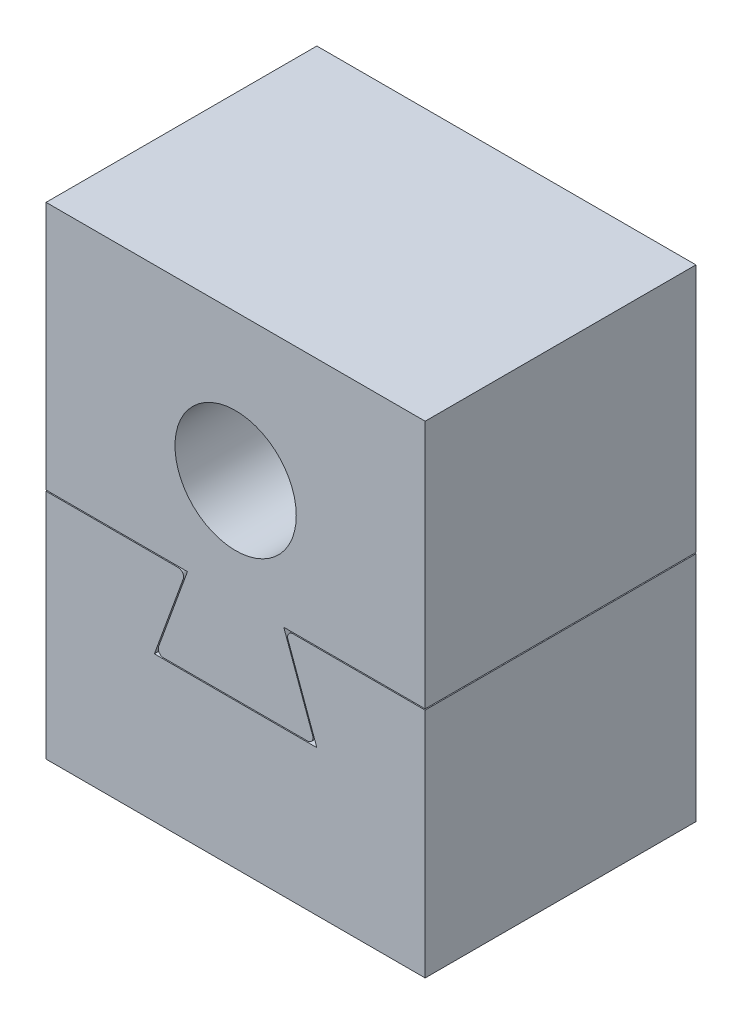
ISO-10303-21;
HEADER;
FILE_DESCRIPTION(('STEP AP214'),'2;1');
FILE_NAME('part.step','',(''),(''),'','','');
FILE_SCHEMA(('AUTOMOTIVE_DESIGN { 1 0 10303 214 1 1 1 1 }'));
ENDSEC;
DATA;
#1=APPLICATION_CONTEXT('core data for automotive mechanical design processes');
#2=APPLICATION_PROTOCOL_DEFINITION('international standard','automotive_design',2000,#1);
#3=PRODUCT_CONTEXT('',#1,'mechanical');
#4=PRODUCT('Part','Part','',(#3));
#5=PRODUCT_RELATED_PRODUCT_CATEGORY('part','',(#4));
#6=PRODUCT_DEFINITION_FORMATION('','',#4);
#7=PRODUCT_DEFINITION_CONTEXT('part definition',#1,'design');
#8=PRODUCT_DEFINITION('design','',#6,#7);
#9=PRODUCT_DEFINITION_SHAPE('','',#8);
#10=(LENGTH_UNIT() NAMED_UNIT(*) SI_UNIT(.MILLI.,.METRE.));
#11=(NAMED_UNIT(*) PLANE_ANGLE_UNIT() SI_UNIT($,.RADIAN.));
#12=(NAMED_UNIT(*) SI_UNIT($,.STERADIAN.) SOLID_ANGLE_UNIT());
#13=UNCERTAINTY_MEASURE_WITH_UNIT(LENGTH_MEASURE(1.E-05),#10,'distance_accuracy_value','');
#14=(GEOMETRIC_REPRESENTATION_CONTEXT(3) GLOBAL_UNCERTAINTY_ASSIGNED_CONTEXT((#13)) GLOBAL_UNIT_ASSIGNED_CONTEXT((#10,
#11,#12)) REPRESENTATION_CONTEXT('',''));
#15=CARTESIAN_POINT('',(0.,0.,0.));
#16=DIRECTION('',(0.,0.,1.));
#17=DIRECTION('',(1.,0.,0.));
#18=AXIS2_PLACEMENT_3D('',#15,#16,#17);
#19=CARTESIAN_POINT('',(0.,0.,25.));
#20=DIRECTION('',(0.,0.,1.));
#21=DIRECTION('',(1.,0.,0.));
#22=AXIS2_PLACEMENT_3D('',#19,#20,#21);
#23=PLANE('',#22);
#24=DIRECTION('',(-1.,0.,0.));
#25=VECTOR('',#24,1.);
#26=CARTESIAN_POINT('',(-7.5,-17.5,25.));
#27=LINE('',#26,#25);
#28=CARTESIAN_POINT('',(6.64311119595473,-17.5,25.));
#29=VERTEX_POINT('',#28);
#30=CARTESIAN_POINT('',(-6.64311119595473,-17.5,25.));
#31=VERTEX_POINT('',#30);
#32=EDGE_CURVE('E214',#29,#31,#27,.T.);
#33=ORIENTED_EDGE('',*,*,#32,.F.);
#34=CARTESIAN_POINT('',(6.64311119595473,-17.,25.));
#35=DIRECTION('',(0.,0.,1.));
#36=DIRECTION('',(1.,0.,0.));
#37=AXIS2_PLACEMENT_3D('',#34,#35,#36);
#38=CIRCLE('',#37,0.5);
#39=CARTESIAN_POINT('',(7.11295750634769,-16.8289899283372,25.));
#40=VERTEX_POINT('',#39);
#41=EDGE_CURVE('E71',#29,#40,#38,.T.);
#42=ORIENTED_EDGE('',*,*,#41,.T.);
#43=DIRECTION('',(0.342020143325667,-0.939692620785909,0.));
#44=VECTOR('',#43,1.);
#45=CARTESIAN_POINT('',(4.49426886379181,-9.63420201433257,25.));
#46=LINE('',#45,#44);
#47=CARTESIAN_POINT('',(4.4454233251962,-9.5,25.));
#48=VERTEX_POINT('',#47);
#49=EDGE_CURVE('E213',#48,#40,#46,.T.);
#50=ORIENTED_EDGE('',*,*,#49,.F.);
#51=DIRECTION('',(-1.,0.,0.));
#52=VECTOR('',#51,1.);
#53=CARTESIAN_POINT('',(17.5,-9.5,25.));
#54=LINE('',#53,#52);
#55=CARTESIAN_POINT('',(17.5,-9.5,25.));
#56=VERTEX_POINT('',#55);
#57=EDGE_CURVE('E167',#56,#48,#54,.T.);
#58=ORIENTED_EDGE('',*,*,#57,.F.);
#59=DIRECTION('',(0.,1.,0.));
#60=VECTOR('',#59,1.);
#61=CARTESIAN_POINT('',(17.5,13.5,25.));
#62=LINE('',#61,#60);
#63=CARTESIAN_POINT('',(17.5,13.5,25.));
#64=VERTEX_POINT('',#63);
#65=EDGE_CURVE('E143',#56,#64,#62,.T.);
#66=ORIENTED_EDGE('',*,*,#65,.T.);
#67=DIRECTION('',(-1.,0.,0.));
#68=VECTOR('',#67,1.);
#69=CARTESIAN_POINT('',(-17.5,13.5,25.));
#70=LINE('',#69,#68);
#71=CARTESIAN_POINT('',(-17.5,13.5,25.));
#72=VERTEX_POINT('',#71);
#73=EDGE_CURVE('E184',#64,#72,#70,.T.);
#74=ORIENTED_EDGE('',*,*,#73,.T.);
#75=DIRECTION('',(0.,-1.,0.));
#76=VECTOR('',#75,1.);
#77=CARTESIAN_POINT('',(-17.5,13.5,25.));
#78=LINE('',#77,#76);
#79=CARTESIAN_POINT('',(-17.5,-9.5,25.));
#80=VERTEX_POINT('',#79);
#81=EDGE_CURVE('E156',#72,#80,#78,.T.);
#82=ORIENTED_EDGE('',*,*,#81,.T.);
#83=DIRECTION('',(1.,0.,0.));
#84=VECTOR('',#83,1.);
#85=CARTESIAN_POINT('',(-17.5,-9.5,25.));
#86=LINE('',#85,#84);
#87=CARTESIAN_POINT('',(-4.44542332519619,-9.5,25.));
#88=VERTEX_POINT('',#87);
#89=EDGE_CURVE('E218',#88,#80,#86,.F.);
#90=ORIENTED_EDGE('',*,*,#89,.F.);
#91=DIRECTION('',(0.342020143325666,0.939692620785909,0.));
#92=VECTOR('',#91,1.);
#93=CARTESIAN_POINT('',(-4.49426886379181,-9.63420201433257,25.));
#94=LINE('',#93,#92);
#95=CARTESIAN_POINT('',(-7.11295750634768,-16.8289899283372,25.));
#96=VERTEX_POINT('',#95);
#97=EDGE_CURVE('E209',#96,#88,#94,.T.);
#98=ORIENTED_EDGE('',*,*,#97,.F.);
#99=CARTESIAN_POINT('',(-6.64311119595473,-17.,25.));
#100=DIRECTION('',(0.,0.,1.));
#101=DIRECTION('',(1.,0.,0.));
#102=AXIS2_PLACEMENT_3D('',#99,#100,#101);
#103=CIRCLE('',#102,0.5);
#104=EDGE_CURVE('E166',#96,#31,#103,.T.);
#105=ORIENTED_EDGE('',*,*,#104,.T.);
#106=EDGE_LOOP('',(#33,#42,#50,#58,#66,#74,#82,#90,#98,#105));
#107=FACE_BOUND('',#106,.T.);
#108=CARTESIAN_POINT('',(0.,0.,25.));
#109=DIRECTION('',(0.,0.,1.));
#110=DIRECTION('',(1.,0.,0.));
#111=AXIS2_PLACEMENT_3D('',#108,#109,#110);
#112=CIRCLE('',#111,5.6);
#113=CARTESIAN_POINT('',(5.6,0.,25.));
#114=VERTEX_POINT('',#113);
#115=EDGE_CURVE('E201',#114,#114,#112,.T.);
#116=ORIENTED_EDGE('',*,*,#115,.F.);
#117=EDGE_LOOP('',(#116));
#118=FACE_BOUND('',#117,.T.);
#119=ADVANCED_FACE('F47',(#107,#118),#23,.T.);
#120=CARTESIAN_POINT('',(0.,0.,0.));
#121=DIRECTION('',(0.,0.,1.));
#122=DIRECTION('',(1.,0.,0.));
#123=AXIS2_PLACEMENT_3D('',#120,#121,#122);
#124=PLANE('',#123);
#125=DIRECTION('',(0.342020143325667,-0.939692620785909,0.));
#126=VECTOR('',#125,1.);
#127=CARTESIAN_POINT('',(0.872166434376077,0.317442621438977,0.));
#128=LINE('',#127,#126);
#129=CARTESIAN_POINT('',(4.4454233251962,-9.5,0.));
#130=VERTEX_POINT('',#129);
#131=CARTESIAN_POINT('',(7.11295750634769,-16.8289899283372,0.));
#132=VERTEX_POINT('',#131);
#133=EDGE_CURVE('E134',#130,#132,#128,.T.);
#134=ORIENTED_EDGE('',*,*,#133,.T.);
#135=CARTESIAN_POINT('',(6.64311119595473,-17.,0.));
#136=DIRECTION('',(0.,0.,1.));
#137=DIRECTION('',(1.,0.,0.));
#138=AXIS2_PLACEMENT_3D('',#135,#136,#137);
#139=CIRCLE('',#138,0.5);
#140=CARTESIAN_POINT('',(6.64311119595473,-17.5,0.));
#141=VERTEX_POINT('',#140);
#142=EDGE_CURVE('E12',#132,#141,#139,.F.);
#143=ORIENTED_EDGE('',*,*,#142,.T.);
#144=DIRECTION('',(-1.,0.,0.));
#145=VECTOR('',#144,1.);
#146=CARTESIAN_POINT('',(0.,-17.5,0.));
#147=LINE('',#146,#145);
#148=CARTESIAN_POINT('',(-6.64311119595473,-17.5,0.));
#149=VERTEX_POINT('',#148);
#150=EDGE_CURVE('E195',#141,#149,#147,.T.);
#151=ORIENTED_EDGE('',*,*,#150,.T.);
#152=CARTESIAN_POINT('',(-6.64311119595473,-17.,0.));
#153=DIRECTION('',(0.,0.,1.));
#154=DIRECTION('',(1.,0.,0.));
#155=AXIS2_PLACEMENT_3D('',#152,#153,#154);
#156=CIRCLE('',#155,0.5);
#157=CARTESIAN_POINT('',(-7.11295750634768,-16.8289899283372,0.));
#158=VERTEX_POINT('',#157);
#159=EDGE_CURVE('E173',#149,#158,#156,.F.);
#160=ORIENTED_EDGE('',*,*,#159,.T.);
#161=DIRECTION('',(0.342020143325666,0.939692620785909,0.));
#162=VECTOR('',#161,1.);
#163=CARTESIAN_POINT('',(-0.872166434376076,0.317442621438976,0.));
#164=LINE('',#163,#162);
#165=CARTESIAN_POINT('',(-4.44542332519619,-9.5,0.));
#166=VERTEX_POINT('',#165);
#167=EDGE_CURVE('E193',#158,#166,#164,.T.);
#168=ORIENTED_EDGE('',*,*,#167,.T.);
#169=DIRECTION('',(-1.,0.,0.));
#170=VECTOR('',#169,1.);
#171=CARTESIAN_POINT('',(0.,-9.5,0.));
#172=LINE('',#171,#170);
#173=CARTESIAN_POINT('',(-17.5,-9.5,0.));
#174=VERTEX_POINT('',#173);
#175=EDGE_CURVE('E135',#166,#174,#172,.T.);
#176=ORIENTED_EDGE('',*,*,#175,.T.);
#177=DIRECTION('',(0.,-1.,0.));
#178=VECTOR('',#177,1.);
#179=CARTESIAN_POINT('',(-17.5,13.5,0.));
#180=LINE('',#179,#178);
#181=CARTESIAN_POINT('',(-17.5,13.5,0.));
#182=VERTEX_POINT('',#181);
#183=EDGE_CURVE('E158',#182,#174,#180,.T.);
#184=ORIENTED_EDGE('',*,*,#183,.F.);
#185=DIRECTION('',(-1.,0.,0.));
#186=VECTOR('',#185,1.);
#187=CARTESIAN_POINT('',(-17.5,13.5,0.));
#188=LINE('',#187,#186);
#189=CARTESIAN_POINT('',(17.5,13.5,0.));
#190=VERTEX_POINT('',#189);
#191=EDGE_CURVE('E150',#190,#182,#188,.T.);
#192=ORIENTED_EDGE('',*,*,#191,.F.);
#193=DIRECTION('',(0.,1.,0.));
#194=VECTOR('',#193,1.);
#195=CARTESIAN_POINT('',(17.5,13.5,0.));
#196=LINE('',#195,#194);
#197=CARTESIAN_POINT('',(17.5,-9.49999999999999,0.));
#198=VERTEX_POINT('',#197);
#199=EDGE_CURVE('E141',#198,#190,#196,.T.);
#200=ORIENTED_EDGE('',*,*,#199,.F.);
#201=DIRECTION('',(-1.,0.,0.));
#202=VECTOR('',#201,1.);
#203=CARTESIAN_POINT('',(0.,-9.5,0.));
#204=LINE('',#203,#202);
#205=EDGE_CURVE('E125',#198,#130,#204,.T.);
#206=ORIENTED_EDGE('',*,*,#205,.T.);
#207=EDGE_LOOP('',(#134,#143,#151,#160,#168,#176,#184,#192,#200,#206));
#208=FACE_BOUND('',#207,.T.);
#209=CARTESIAN_POINT('',(0.,0.,0.));
#210=DIRECTION('',(0.,0.,1.));
#211=DIRECTION('',(1.,0.,0.));
#212=AXIS2_PLACEMENT_3D('',#209,#210,#211);
#213=CIRCLE('',#212,5.6);
#214=CARTESIAN_POINT('',(5.6,0.,0.));
#215=VERTEX_POINT('',#214);
#216=EDGE_CURVE('E162',#215,#215,#213,.T.);
#217=ORIENTED_EDGE('',*,*,#216,.T.);
#218=EDGE_LOOP('',(#217));
#219=FACE_BOUND('',#218,.T.);
#220=ADVANCED_FACE('F147',(#208,#219),#124,.F.);
#221=CARTESIAN_POINT('',(-17.5,13.5,25.));
#222=DIRECTION('',(1.,0.,0.));
#223=DIRECTION('',(0.,1.,0.));
#224=AXIS2_PLACEMENT_3D('',#221,#222,#223);
#225=PLANE('',#224);
#226=ORIENTED_EDGE('',*,*,#183,.T.);
#227=DIRECTION('',(0.,0.,1.));
#228=VECTOR('',#227,1.);
#229=CARTESIAN_POINT('',(-17.5,-9.5,25.));
#230=LINE('',#229,#228);
#231=EDGE_CURVE('E161',#174,#80,#230,.T.);
#232=ORIENTED_EDGE('',*,*,#231,.T.);
#233=ORIENTED_EDGE('',*,*,#81,.F.);
#234=DIRECTION('',(0.,0.,-1.));
#235=VECTOR('',#234,1.);
#236=CARTESIAN_POINT('',(-17.5,13.5,25.));
#237=LINE('',#236,#235);
#238=EDGE_CURVE('E144',#72,#182,#237,.T.);
#239=ORIENTED_EDGE('',*,*,#238,.T.);
#240=EDGE_LOOP('',(#226,#232,#233,#239));
#241=FACE_BOUND('',#240,.T.);
#242=ADVANCED_FACE('F232',(#241),#225,.F.);
#243=CARTESIAN_POINT('',(17.5,13.5,25.));
#244=DIRECTION('',(-1.,0.,0.));
#245=DIRECTION('',(0.,-1.,0.));
#246=AXIS2_PLACEMENT_3D('',#243,#244,#245);
#247=PLANE('',#246);
#248=ORIENTED_EDGE('',*,*,#65,.F.);
#249=DIRECTION('',(0.,0.,-1.));
#250=VECTOR('',#249,1.);
#251=CARTESIAN_POINT('',(17.5,-9.5,25.));
#252=LINE('',#251,#250);
#253=EDGE_CURVE('E129',#56,#198,#252,.T.);
#254=ORIENTED_EDGE('',*,*,#253,.T.);
#255=ORIENTED_EDGE('',*,*,#199,.T.);
#256=DIRECTION('',(0.,0.,-1.));
#257=VECTOR('',#256,1.);
#258=CARTESIAN_POINT('',(17.5,13.5,25.));
#259=LINE('',#258,#257);
#260=EDGE_CURVE('E152',#64,#190,#259,.T.);
#261=ORIENTED_EDGE('',*,*,#260,.F.);
#262=EDGE_LOOP('',(#248,#254,#255,#261));
#263=FACE_BOUND('',#262,.T.);
#264=ADVANCED_FACE('F139',(#263),#247,.F.);
#265=CARTESIAN_POINT('',(-17.5,13.5,25.));
#266=DIRECTION('',(0.,-1.,0.));
#267=DIRECTION('',(1.,0.,0.));
#268=AXIS2_PLACEMENT_3D('',#265,#266,#267);
#269=PLANE('',#268);
#270=ORIENTED_EDGE('',*,*,#191,.T.);
#271=ORIENTED_EDGE('',*,*,#238,.F.);
#272=ORIENTED_EDGE('',*,*,#73,.F.);
#273=ORIENTED_EDGE('',*,*,#260,.T.);
#274=EDGE_LOOP('',(#270,#271,#272,#273));
#275=FACE_BOUND('',#274,.T.);
#276=ADVANCED_FACE('F237',(#275),#269,.F.);
#277=CARTESIAN_POINT('',(0.,0.,25.));
#278=DIRECTION('',(0.,0.,-1.));
#279=DIRECTION('',(-1.,0.,0.));
#280=AXIS2_PLACEMENT_3D('',#277,#278,#279);
#281=CYLINDRICAL_SURFACE('',#280,5.6);
#282=ORIENTED_EDGE('',*,*,#115,.T.);
#283=EDGE_LOOP('',(#282));
#284=FACE_BOUND('',#283,.T.);
#285=ORIENTED_EDGE('',*,*,#216,.F.);
#286=EDGE_LOOP('',(#285));
#287=FACE_BOUND('',#286,.T.);
#288=ADVANCED_FACE('F278',(#284,#287),#281,.F.);
#289=CARTESIAN_POINT('',(-4.49426886379181,-9.63420201433257,-5.1));
#290=DIRECTION('',(0.939692620785909,-0.342020143325666,0.));
#291=DIRECTION('',(0.342020143325666,0.939692620785909,0.));
#292=AXIS2_PLACEMENT_3D('',#289,#290,#291);
#293=PLANE('',#292);
#294=CARTESIAN_POINT('',(-5.93770128568761,-13.6,19.));
#295=DIRECTION('',(0.939692620785909,-0.342020143325666,0.));
#296=DIRECTION('',(-0.342020143325666,-0.939692620785909,0.));
#297=AXIS2_PLACEMENT_3D('',#294,#295,#296);
#298=ELLIPSE('',#297,2.2347733221994,2.09999999999999);
#299=CARTESIAN_POINT('',(-6.70203877764662,-15.7,19.));
#300=VERTEX_POINT('',#299);
#301=EDGE_CURVE('E51',#300,#300,#298,.T.);
#302=ORIENTED_EDGE('',*,*,#301,.T.);
#303=EDGE_LOOP('',(#302));
#304=FACE_BOUND('',#303,.T.);
#305=CARTESIAN_POINT('',(-5.93770128568761,-13.6,6.));
#306=DIRECTION('',(0.939692620785909,-0.342020143325666,0.));
#307=DIRECTION('',(-0.342020143325666,-0.939692620785909,0.));
#308=AXIS2_PLACEMENT_3D('',#305,#306,#307);
#309=ELLIPSE('',#308,2.2347733221994,2.09999999999999);
#310=CARTESIAN_POINT('',(-6.70203877764662,-15.7,6.));
#311=VERTEX_POINT('',#310);
#312=EDGE_CURVE('E179',#311,#311,#309,.T.);
#313=ORIENTED_EDGE('',*,*,#312,.T.);
#314=EDGE_LOOP('',(#313));
#315=FACE_BOUND('',#314,.T.);
#316=ORIENTED_EDGE('',*,*,#167,.F.);
#317=DIRECTION('',(0.,0.,1.));
#318=VECTOR('',#317,1.);
#319=CARTESIAN_POINT('',(-7.11295750634768,-16.8289899283372,-5.1));
#320=LINE('',#319,#318);
#321=EDGE_CURVE('E163',#158,#96,#320,.T.);
#322=ORIENTED_EDGE('',*,*,#321,.T.);
#323=ORIENTED_EDGE('',*,*,#97,.T.);
#324=DIRECTION('',(0.,0.,1.));
#325=VECTOR('',#324,1.);
#326=CARTESIAN_POINT('',(-4.44542332519619,-9.5,-5.1));
#327=LINE('',#326,#325);
#328=EDGE_CURVE('E215',#166,#88,#327,.T.);
#329=ORIENTED_EDGE('',*,*,#328,.F.);
#330=EDGE_LOOP('',(#316,#322,#323,#329));
#331=FACE_BOUND('',#330,.T.);
#332=ADVANCED_FACE('F240',(#304,#315,#331),#293,.F.);
#333=CARTESIAN_POINT('',(-7.5,-17.5,-5.1));
#334=DIRECTION('',(0.,1.,0.));
#335=DIRECTION('',(-1.,0.,0.));
#336=AXIS2_PLACEMENT_3D('',#333,#334,#335);
#337=PLANE('',#336);
#338=ORIENTED_EDGE('',*,*,#150,.F.);
#339=DIRECTION('',(0.,0.,1.));
#340=VECTOR('',#339,1.);
#341=CARTESIAN_POINT('',(6.64311119595473,-17.5,-5.1));
#342=LINE('',#341,#340);
#343=EDGE_CURVE('E175',#141,#29,#342,.T.);
#344=ORIENTED_EDGE('',*,*,#343,.T.);
#345=ORIENTED_EDGE('',*,*,#32,.T.);
#346=DIRECTION('',(0.,0.,1.));
#347=VECTOR('',#346,1.);
#348=CARTESIAN_POINT('',(-6.64311119595473,-17.5,-5.1));
#349=LINE('',#348,#347);
#350=EDGE_CURVE('E170',#31,#149,#349,.F.);
#351=ORIENTED_EDGE('',*,*,#350,.T.);
#352=EDGE_LOOP('',(#338,#344,#345,#351));
#353=FACE_BOUND('',#352,.T.);
#354=ADVANCED_FACE('F248',(#353),#337,.F.);
#355=CARTESIAN_POINT('',(4.49426886379181,-9.63420201433257,-5.1));
#356=DIRECTION('',(-0.939692620785909,-0.342020143325667,0.));
#357=DIRECTION('',(0.342020143325667,-0.939692620785909,0.));
#358=AXIS2_PLACEMENT_3D('',#355,#356,#357);
#359=PLANE('',#358);
#360=ORIENTED_EDGE('',*,*,#49,.T.);
#361=DIRECTION('',(0.,0.,1.));
#362=VECTOR('',#361,1.);
#363=CARTESIAN_POINT('',(7.11295750634769,-16.8289899283372,-5.1));
#364=LINE('',#363,#362);
#365=EDGE_CURVE('E56',#40,#132,#364,.F.);
#366=ORIENTED_EDGE('',*,*,#365,.T.);
#367=ORIENTED_EDGE('',*,*,#133,.F.);
#368=DIRECTION('',(0.,0.,1.));
#369=VECTOR('',#368,1.);
#370=CARTESIAN_POINT('',(4.4454233251962,-9.5,-5.1));
#371=LINE('',#370,#369);
#372=EDGE_CURVE('E131',#130,#48,#371,.T.);
#373=ORIENTED_EDGE('',*,*,#372,.T.);
#374=EDGE_LOOP('',(#360,#366,#367,#373));
#375=FACE_BOUND('',#374,.T.);
#376=ADVANCED_FACE('F252',(#375),#359,.F.);
#377=CARTESIAN_POINT('',(-17.5,-9.5,-5.1));
#378=DIRECTION('',(0.,1.,0.));
#379=DIRECTION('',(0.,0.,1.));
#380=AXIS2_PLACEMENT_3D('',#377,#378,#379);
#381=PLANE('',#380);
#382=ORIENTED_EDGE('',*,*,#328,.T.);
#383=ORIENTED_EDGE('',*,*,#89,.T.);
#384=ORIENTED_EDGE('',*,*,#231,.F.);
#385=ORIENTED_EDGE('',*,*,#175,.F.);
#386=EDGE_LOOP('',(#382,#383,#384,#385));
#387=FACE_BOUND('',#386,.T.);
#388=ADVANCED_FACE('F225',(#387),#381,.F.);
#389=CARTESIAN_POINT('',(17.5,-9.5,-5.1));
#390=DIRECTION('',(0.,1.,0.));
#391=DIRECTION('',(-1.,0.,0.));
#392=AXIS2_PLACEMENT_3D('',#389,#390,#391);
#393=PLANE('',#392);
#394=ORIENTED_EDGE('',*,*,#253,.F.);
#395=ORIENTED_EDGE('',*,*,#57,.T.);
#396=ORIENTED_EDGE('',*,*,#372,.F.);
#397=ORIENTED_EDGE('',*,*,#205,.F.);
#398=EDGE_LOOP('',(#394,#395,#396,#397));
#399=FACE_BOUND('',#398,.T.);
#400=ADVANCED_FACE('F127',(#399),#393,.F.);
#401=CARTESIAN_POINT('',(-6.64311119595473,-17.,-5.1));
#402=DIRECTION('',(0.,0.,1.));
#403=DIRECTION('',(1.,0.,0.));
#404=AXIS2_PLACEMENT_3D('',#401,#402,#403);
#405=CYLINDRICAL_SURFACE('',#404,0.5);
#406=ORIENTED_EDGE('',*,*,#159,.F.);
#407=ORIENTED_EDGE('',*,*,#350,.F.);
#408=ORIENTED_EDGE('',*,*,#104,.F.);
#409=ORIENTED_EDGE('',*,*,#321,.F.);
#410=EDGE_LOOP('',(#406,#407,#408,#409));
#411=FACE_BOUND('',#410,.T.);
#412=ADVANCED_FACE('F245',(#411),#405,.T.);
#413=CARTESIAN_POINT('',(6.64311119595473,-17.,-5.1));
#414=DIRECTION('',(0.,0.,1.));
#415=DIRECTION('',(1.,0.,0.));
#416=AXIS2_PLACEMENT_3D('',#413,#414,#415);
#417=CYLINDRICAL_SURFACE('',#416,0.5);
#418=ORIENTED_EDGE('',*,*,#142,.F.);
#419=ORIENTED_EDGE('',*,*,#365,.F.);
#420=ORIENTED_EDGE('',*,*,#41,.F.);
#421=ORIENTED_EDGE('',*,*,#343,.F.);
#422=EDGE_LOOP('',(#418,#419,#420,#421));
#423=FACE_BOUND('',#422,.T.);
#424=ADVANCED_FACE('F49',(#423),#417,.T.);
#425=CARTESIAN_POINT('',(-17.5,-13.6,6.));
#426=DIRECTION('',(-1.,0.,0.));
#427=DIRECTION('',(0.,0.,1.));
#428=AXIS2_PLACEMENT_3D('',#425,#426,#427);
#429=CYLINDRICAL_SURFACE('',#428,2.09999999999999);
#430=CARTESIAN_POINT('',(-4.8314658188485,-13.6,6.));
#431=DIRECTION('',(-1.,0.,0.));
#432=DIRECTION('',(0.,0.,1.));
#433=AXIS2_PLACEMENT_3D('',#430,#431,#432);
#434=CIRCLE('',#433,2.09999999999999);
#435=CARTESIAN_POINT('',(-4.8314658188485,-13.6,8.1));
#436=VERTEX_POINT('',#435);
#437=EDGE_CURVE('E181',#436,#436,#434,.T.);
#438=ORIENTED_EDGE('',*,*,#437,.F.);
#439=EDGE_LOOP('',(#438));
#440=FACE_BOUND('',#439,.T.);
#441=ORIENTED_EDGE('',*,*,#312,.F.);
#442=EDGE_LOOP('',(#441));
#443=FACE_BOUND('',#442,.T.);
#444=ADVANCED_FACE('F274',(#440,#443),#429,.F.);
#445=CARTESIAN_POINT('',(-4.8314658188485,-13.6,6.));
#446=DIRECTION('',(1.,0.,0.));
#447=DIRECTION('',(0.,0.,-1.));
#448=AXIS2_PLACEMENT_3D('',#445,#446,#447);
#449=PLANE('',#448);
#450=ORIENTED_EDGE('',*,*,#437,.T.);
#451=EDGE_LOOP('',(#450));
#452=FACE_BOUND('',#451,.T.);
#453=ADVANCED_FACE('F284',(#452),#449,.F.);
#454=CARTESIAN_POINT('',(-17.5,-13.6,19.));
#455=DIRECTION('',(-1.,0.,0.));
#456=DIRECTION('',(0.,0.,1.));
#457=AXIS2_PLACEMENT_3D('',#454,#455,#456);
#458=CYLINDRICAL_SURFACE('',#457,2.09999999999999);
#459=CARTESIAN_POINT('',(-4.8314658188485,-13.6,19.));
#460=DIRECTION('',(-1.,0.,0.));
#461=DIRECTION('',(0.,0.,1.));
#462=AXIS2_PLACEMENT_3D('',#459,#460,#461);
#463=CIRCLE('',#462,2.09999999999999);
#464=CARTESIAN_POINT('',(-4.8314658188485,-13.6,21.1));
#465=VERTEX_POINT('',#464);
#466=EDGE_CURVE('E190',#465,#465,#463,.T.);
#467=ORIENTED_EDGE('',*,*,#466,.F.);
#468=EDGE_LOOP('',(#467));
#469=FACE_BOUND('',#468,.T.);
#470=ORIENTED_EDGE('',*,*,#301,.F.);
#471=EDGE_LOOP('',(#470));
#472=FACE_BOUND('',#471,.T.);
#473=ADVANCED_FACE('F287',(#469,#472),#458,.F.);
#474=CARTESIAN_POINT('',(-4.8314658188485,-13.6,19.));
#475=DIRECTION('',(1.,0.,0.));
#476=DIRECTION('',(0.,0.,-1.));
#477=AXIS2_PLACEMENT_3D('',#474,#475,#476);
#478=PLANE('',#477);
#479=ORIENTED_EDGE('',*,*,#466,.T.);
#480=EDGE_LOOP('',(#479));
#481=FACE_BOUND('',#480,.T.);
#482=ADVANCED_FACE('F291',(#481),#478,.F.);
#483=CLOSED_SHELL('',(#119,#220,#242,#264,#276,#288,#332,#354,#376,#388,#400,#412,#424,#444,
#453,#473,#482));
#484=MANIFOLD_SOLID_BREP('B2',#483);
#485=CARTESIAN_POINT('',(-17.5,-31.02,25.));
#486=DIRECTION('',(0.,1.,0.));
#487=DIRECTION('',(0.,0.,1.));
#488=AXIS2_PLACEMENT_3D('',#485,#486,#487);
#489=PLANE('',#488);
#490=CARTESIAN_POINT('',(11.5,-31.02,12.5));
#491=DIRECTION('',(0.,-1.,0.));
#492=DIRECTION('',(0.,0.,-1.));
#493=AXIS2_PLACEMENT_3D('',#490,#491,#492);
#494=CIRCLE('',#493,2.09999999999999);
#495=CARTESIAN_POINT('',(11.5,-31.02,10.4));
#496=VERTEX_POINT('',#495);
#497=EDGE_CURVE('E656',#496,#496,#494,.T.);
#498=ORIENTED_EDGE('',*,*,#497,.F.);
#499=EDGE_LOOP('',(#498));
#500=FACE_BOUND('',#499,.T.);
#501=DIRECTION('',(1.,0.,0.));
#502=VECTOR('',#501,1.);
#503=CARTESIAN_POINT('',(-17.5,-31.02,0.));
#504=LINE('',#503,#502);
#505=CARTESIAN_POINT('',(-17.5,-31.02,0.));
#506=VERTEX_POINT('',#505);
#507=CARTESIAN_POINT('',(17.5,-31.02,0.));
#508=VERTEX_POINT('',#507);
#509=EDGE_CURVE('E508',#506,#508,#504,.T.);
#510=ORIENTED_EDGE('',*,*,#509,.T.);
#511=DIRECTION('',(0.,0.,-1.));
#512=VECTOR('',#511,1.);
#513=CARTESIAN_POINT('',(17.5,-31.02,25.));
#514=LINE('',#513,#512);
#515=CARTESIAN_POINT('',(17.5,-31.02,25.));
#516=VERTEX_POINT('',#515);
#517=EDGE_CURVE('E515',#516,#508,#514,.T.);
#518=ORIENTED_EDGE('',*,*,#517,.F.);
#519=DIRECTION('',(1.,0.,0.));
#520=VECTOR('',#519,1.);
#521=CARTESIAN_POINT('',(-17.5,-31.02,25.));
#522=LINE('',#521,#520);
#523=CARTESIAN_POINT('',(-17.5,-31.02,25.));
#524=VERTEX_POINT('',#523);
#525=EDGE_CURVE('E502',#524,#516,#522,.T.);
#526=ORIENTED_EDGE('',*,*,#525,.F.);
#527=DIRECTION('',(0.,0.,-1.));
#528=VECTOR('',#527,1.);
#529=CARTESIAN_POINT('',(-17.5,-31.02,25.));
#530=LINE('',#529,#528);
#531=EDGE_CURVE('E501',#524,#506,#530,.T.);
#532=ORIENTED_EDGE('',*,*,#531,.T.);
#533=EDGE_LOOP('',(#510,#518,#526,#532));
#534=FACE_BOUND('',#533,.T.);
#535=CARTESIAN_POINT('',(-11.5,-31.02,12.5));
#536=DIRECTION('',(0.,-1.,0.));
#537=DIRECTION('',(0.,0.,-1.));
#538=AXIS2_PLACEMENT_3D('',#535,#536,#537);
#539=CIRCLE('',#538,2.09999999999999);
#540=CARTESIAN_POINT('',(-11.5,-31.02,10.4));
#541=VERTEX_POINT('',#540);
#542=EDGE_CURVE('E662',#541,#541,#539,.T.);
#543=ORIENTED_EDGE('',*,*,#542,.F.);
#544=EDGE_LOOP('',(#543));
#545=FACE_BOUND('',#544,.T.);
#546=ADVANCED_FACE('F408',(#500,#534,#545),#489,.F.);
#547=CARTESIAN_POINT('',(-17.5,13.5,25.));
#548=DIRECTION('',(1.,0.,0.));
#549=DIRECTION('',(0.,1.,0.));
#550=AXIS2_PLACEMENT_3D('',#547,#548,#549);
#551=PLANE('',#550);
#552=CARTESIAN_POINT('',(-17.5,-13.6,19.));
#553=DIRECTION('',(-1.,0.,0.));
#554=DIRECTION('',(0.,0.,1.));
#555=AXIS2_PLACEMENT_3D('',#552,#553,#554);
#556=CIRCLE('',#555,2.09999999999999);
#557=CARTESIAN_POINT('',(-17.5,-13.6,21.1));
#558=VERTEX_POINT('',#557);
#559=EDGE_CURVE('E643',#558,#558,#556,.T.);
#560=ORIENTED_EDGE('',*,*,#559,.F.);
#561=EDGE_LOOP('',(#560));
#562=FACE_BOUND('',#561,.T.);
#563=CARTESIAN_POINT('',(-17.5,-13.6,6.));
#564=DIRECTION('',(-1.,0.,0.));
#565=DIRECTION('',(0.,0.,1.));
#566=AXIS2_PLACEMENT_3D('',#563,#564,#565);
#567=CIRCLE('',#566,2.09999999999999);
#568=CARTESIAN_POINT('',(-17.5,-13.6,8.09999999999999));
#569=VERTEX_POINT('',#568);
#570=EDGE_CURVE('E647',#569,#569,#567,.T.);
#571=ORIENTED_EDGE('',*,*,#570,.F.);
#572=EDGE_LOOP('',(#571));
#573=FACE_BOUND('',#572,.T.);
#574=DIRECTION('',(0.,0.,1.));
#575=VECTOR('',#574,1.);
#576=CARTESIAN_POINT('',(-17.5,-9.6,25.));
#577=LINE('',#576,#575);
#578=CARTESIAN_POINT('',(-17.5,-9.6,0.));
#579=VERTEX_POINT('',#578);
#580=CARTESIAN_POINT('',(-17.5,-9.6,25.));
#581=VERTEX_POINT('',#580);
#582=EDGE_CURVE('E490',#579,#581,#577,.T.);
#583=ORIENTED_EDGE('',*,*,#582,.F.);
#584=DIRECTION('',(0.,-1.,0.));
#585=VECTOR('',#584,1.);
#586=CARTESIAN_POINT('',(-17.5,13.5,0.));
#587=LINE('',#586,#585);
#588=EDGE_CURVE('E516',#579,#506,#587,.T.);
#589=ORIENTED_EDGE('',*,*,#588,.T.);
#590=ORIENTED_EDGE('',*,*,#531,.F.);
#591=DIRECTION('',(0.,-1.,0.));
#592=VECTOR('',#591,1.);
#593=CARTESIAN_POINT('',(-17.5,13.5,25.));
#594=LINE('',#593,#592);
#595=EDGE_CURVE('E484',#581,#524,#594,.T.);
#596=ORIENTED_EDGE('',*,*,#595,.F.);
#597=EDGE_LOOP('',(#583,#589,#590,#596));
#598=FACE_BOUND('',#597,.T.);
#599=ADVANCED_FACE('F499',(#562,#573,#598),#551,.F.);
#600=CARTESIAN_POINT('',(17.5,13.5,25.));
#601=DIRECTION('',(-1.,0.,0.));
#602=DIRECTION('',(0.,-1.,0.));
#603=AXIS2_PLACEMENT_3D('',#600,#601,#602);
#604=PLANE('',#603);
#605=DIRECTION('',(0.,0.,-1.));
#606=VECTOR('',#605,1.);
#607=CARTESIAN_POINT('',(17.5,-9.6,25.));
#608=LINE('',#607,#606);
#609=CARTESIAN_POINT('',(17.5,-9.59999999999999,25.));
#610=VERTEX_POINT('',#609);
#611=CARTESIAN_POINT('',(17.5,-9.6,0.));
#612=VERTEX_POINT('',#611);
#613=EDGE_CURVE('E496',#610,#612,#608,.T.);
#614=ORIENTED_EDGE('',*,*,#613,.F.);
#615=DIRECTION('',(0.,1.,0.));
#616=VECTOR('',#615,1.);
#617=CARTESIAN_POINT('',(17.5,13.5,25.));
#618=LINE('',#617,#616);
#619=EDGE_CURVE('E505',#516,#610,#618,.T.);
#620=ORIENTED_EDGE('',*,*,#619,.F.);
#621=ORIENTED_EDGE('',*,*,#517,.T.);
#622=DIRECTION('',(0.,1.,0.));
#623=VECTOR('',#622,1.);
#624=CARTESIAN_POINT('',(17.5,13.5,0.));
#625=LINE('',#624,#623);
#626=EDGE_CURVE('E503',#508,#612,#625,.T.);
#627=ORIENTED_EDGE('',*,*,#626,.T.);
#628=EDGE_LOOP('',(#614,#620,#621,#627));
#629=FACE_BOUND('',#628,.T.);
#630=ADVANCED_FACE('F602',(#629),#604,.F.);
#631=CARTESIAN_POINT('',(0.,0.,0.));
#632=DIRECTION('',(0.,0.,1.));
#633=DIRECTION('',(1.,0.,0.));
#634=AXIS2_PLACEMENT_3D('',#631,#632,#633);
#635=PLANE('',#634);
#636=DIRECTION('',(-1.,0.,0.));
#637=VECTOR('',#636,1.);
#638=CARTESIAN_POINT('',(0.,-9.6,0.));
#639=LINE('',#638,#637);
#640=CARTESIAN_POINT('',(-5.30231212924146,-9.6,0.));
#641=VERTEX_POINT('',#640);
#642=EDGE_CURVE('E492',#641,#579,#639,.T.);
#643=ORIENTED_EDGE('',*,*,#642,.F.);
#644=CARTESIAN_POINT('',(-5.30231212924146,-10.1,0.));
#645=DIRECTION('',(0.,0.,1.));
#646=DIRECTION('',(1.,0.,0.));
#647=AXIS2_PLACEMENT_3D('',#644,#645,#646);
#648=CIRCLE('',#647,0.5);
#649=CARTESIAN_POINT('',(-4.8324658188485,-10.2710100716628,0.));
#650=VERTEX_POINT('',#649);
#651=EDGE_CURVE('E45',#641,#650,#648,.F.);
#652=ORIENTED_EDGE('',*,*,#651,.T.);
#653=DIRECTION('',(0.342020143325666,0.939692620785909,0.));
#654=VECTOR('',#653,1.);
#655=CARTESIAN_POINT('',(-0.966135696454666,0.351644635771542,0.));
#656=LINE('',#655,#654);
#657=CARTESIAN_POINT('',(-7.5,-17.6,0.));
#658=VERTEX_POINT('',#657);
#659=EDGE_CURVE('E495',#658,#650,#656,.T.);
#660=ORIENTED_EDGE('',*,*,#659,.F.);
#661=DIRECTION('',(-1.,0.,0.));
#662=VECTOR('',#661,1.);
#663=CARTESIAN_POINT('',(0.,-17.6,0.));
#664=LINE('',#663,#662);
#665=CARTESIAN_POINT('',(7.5,-17.6,0.));
#666=VERTEX_POINT('',#665);
#667=EDGE_CURVE('E525',#666,#658,#664,.T.);
#668=ORIENTED_EDGE('',*,*,#667,.F.);
#669=DIRECTION('',(0.342020143325667,-0.939692620785909,0.));
#670=VECTOR('',#669,1.);
#671=CARTESIAN_POINT('',(0.966135696454668,0.351644635771544,0.));
#672=LINE('',#671,#670);
#673=CARTESIAN_POINT('',(4.83246581884851,-10.2710100716628,0.));
#674=VERTEX_POINT('',#673);
#675=EDGE_CURVE('E527',#674,#666,#672,.T.);
#676=ORIENTED_EDGE('',*,*,#675,.F.);
#677=CARTESIAN_POINT('',(5.30231212924146,-10.1,0.));
#678=DIRECTION('',(0.,0.,1.));
#679=DIRECTION('',(1.,0.,0.));
#680=AXIS2_PLACEMENT_3D('',#677,#678,#679);
#681=CIRCLE('',#680,0.5);
#682=CARTESIAN_POINT('',(5.30231212924146,-9.6,0.));
#683=VERTEX_POINT('',#682);
#684=EDGE_CURVE('E536',#674,#683,#681,.F.);
#685=ORIENTED_EDGE('',*,*,#684,.T.);
#686=DIRECTION('',(-1.,0.,0.));
#687=VECTOR('',#686,1.);
#688=CARTESIAN_POINT('',(0.,-9.6,0.));
#689=LINE('',#688,#687);
#690=EDGE_CURVE('E565',#612,#683,#689,.T.);
#691=ORIENTED_EDGE('',*,*,#690,.F.);
#692=ORIENTED_EDGE('',*,*,#626,.F.);
#693=ORIENTED_EDGE('',*,*,#509,.F.);
#694=ORIENTED_EDGE('',*,*,#588,.F.);
#695=EDGE_LOOP('',(#643,#652,#660,#668,#676,#685,#691,#692,#693,#694));
#696=FACE_BOUND('',#695,.T.);
#697=ADVANCED_FACE('F586',(#696),#635,.F.);
#698=CARTESIAN_POINT('',(0.,0.,25.));
#699=DIRECTION('',(0.,0.,1.));
#700=DIRECTION('',(1.,0.,0.));
#701=AXIS2_PLACEMENT_3D('',#698,#699,#700);
#702=PLANE('',#701);
#703=DIRECTION('',(0.342020143325666,0.939692620785909,0.));
#704=VECTOR('',#703,1.);
#705=CARTESIAN_POINT('',(-4.5882381258704,-9.6,25.));
#706=LINE('',#705,#704);
#707=CARTESIAN_POINT('',(-7.5,-17.6,25.));
#708=VERTEX_POINT('',#707);
#709=CARTESIAN_POINT('',(-4.8324658188485,-10.2710100716628,25.));
#710=VERTEX_POINT('',#709);
#711=EDGE_CURVE('E486',#708,#710,#706,.T.);
#712=ORIENTED_EDGE('',*,*,#711,.T.);
#713=CARTESIAN_POINT('',(-5.30231212924146,-10.1,25.));
#714=DIRECTION('',(0.,0.,1.));
#715=DIRECTION('',(1.,0.,0.));
#716=AXIS2_PLACEMENT_3D('',#713,#714,#715);
#717=CIRCLE('',#716,0.5);
#718=CARTESIAN_POINT('',(-5.30231212924146,-9.6,25.));
#719=VERTEX_POINT('',#718);
#720=EDGE_CURVE('E430',#710,#719,#717,.T.);
#721=ORIENTED_EDGE('',*,*,#720,.T.);
#722=DIRECTION('',(-1.,0.,0.));
#723=VECTOR('',#722,1.);
#724=CARTESIAN_POINT('',(-17.5,-9.6,25.));
#725=LINE('',#724,#723);
#726=EDGE_CURVE('E480',#719,#581,#725,.T.);
#727=ORIENTED_EDGE('',*,*,#726,.T.);
#728=ORIENTED_EDGE('',*,*,#595,.T.);
#729=ORIENTED_EDGE('',*,*,#525,.T.);
#730=ORIENTED_EDGE('',*,*,#619,.T.);
#731=DIRECTION('',(-1.,0.,0.));
#732=VECTOR('',#731,1.);
#733=CARTESIAN_POINT('',(17.5,-9.6,25.));
#734=LINE('',#733,#732);
#735=CARTESIAN_POINT('',(5.30231212924146,-9.6,25.));
#736=VERTEX_POINT('',#735);
#737=EDGE_CURVE('E558',#610,#736,#734,.T.);
#738=ORIENTED_EDGE('',*,*,#737,.T.);
#739=CARTESIAN_POINT('',(5.30231212924146,-10.1,25.));
#740=DIRECTION('',(0.,0.,1.));
#741=DIRECTION('',(1.,0.,0.));
#742=AXIS2_PLACEMENT_3D('',#739,#740,#741);
#743=CIRCLE('',#742,0.5);
#744=CARTESIAN_POINT('',(4.83246581884851,-10.2710100716628,25.));
#745=VERTEX_POINT('',#744);
#746=EDGE_CURVE('E532',#736,#745,#743,.T.);
#747=ORIENTED_EDGE('',*,*,#746,.T.);
#748=DIRECTION('',(0.342020143325667,-0.939692620785909,0.));
#749=VECTOR('',#748,1.);
#750=CARTESIAN_POINT('',(4.58823812587041,-9.6,25.));
#751=LINE('',#750,#749);
#752=CARTESIAN_POINT('',(7.5,-17.6,25.));
#753=VERTEX_POINT('',#752);
#754=EDGE_CURVE('E553',#745,#753,#751,.T.);
#755=ORIENTED_EDGE('',*,*,#754,.T.);
#756=DIRECTION('',(-1.,0.,0.));
#757=VECTOR('',#756,1.);
#758=CARTESIAN_POINT('',(-7.5,-17.6,25.));
#759=LINE('',#758,#757);
#760=EDGE_CURVE('E551',#753,#708,#759,.T.);
#761=ORIENTED_EDGE('',*,*,#760,.T.);
#762=EDGE_LOOP('',(#712,#721,#727,#728,#729,#730,#738,#747,#755,#761));
#763=FACE_BOUND('',#762,.T.);
#764=ADVANCED_FACE('F482',(#763),#702,.T.);
#765=CARTESIAN_POINT('',(-17.5,-9.6,-5.1));
#766=DIRECTION('',(0.,1.,0.));
#767=DIRECTION('',(0.,0.,1.));
#768=AXIS2_PLACEMENT_3D('',#765,#766,#767);
#769=PLANE('',#768);
#770=CARTESIAN_POINT('',(-11.5,-9.6,12.5));
#771=DIRECTION('',(0.,1.,0.));
#772=DIRECTION('',(0.,0.,1.));
#773=AXIS2_PLACEMENT_3D('',#770,#771,#772);
#774=CIRCLE('',#773,2.09999999999999);
#775=CARTESIAN_POINT('',(-11.5,-9.6,14.6));
#776=VERTEX_POINT('',#775);
#777=EDGE_CURVE('E487',#776,#776,#774,.T.);
#778=ORIENTED_EDGE('',*,*,#777,.F.);
#779=EDGE_LOOP('',(#778));
#780=FACE_BOUND('',#779,.T.);
#781=ORIENTED_EDGE('',*,*,#726,.F.);
#782=DIRECTION('',(0.,0.,1.));
#783=VECTOR('',#782,1.);
#784=CARTESIAN_POINT('',(-5.30231212924146,-9.6,-5.1));
#785=LINE('',#784,#783);
#786=EDGE_CURVE('E416',#719,#641,#785,.F.);
#787=ORIENTED_EDGE('',*,*,#786,.T.);
#788=ORIENTED_EDGE('',*,*,#642,.T.);
#789=ORIENTED_EDGE('',*,*,#582,.T.);
#790=EDGE_LOOP('',(#781,#787,#788,#789));
#791=FACE_BOUND('',#790,.T.);
#792=ADVANCED_FACE('F491',(#780,#791),#769,.T.);
#793=CARTESIAN_POINT('',(-4.5882381258704,-9.6,-5.1));
#794=DIRECTION('',(0.939692620785909,-0.342020143325666,0.));
#795=DIRECTION('',(0.342020143325666,0.939692620785909,0.));
#796=AXIS2_PLACEMENT_3D('',#793,#794,#795);
#797=PLANE('',#796);
#798=CARTESIAN_POINT('',(-6.0441190629352,-13.6,19.));
#799=DIRECTION('',(0.939692620785909,-0.342020143325666,0.));
#800=DIRECTION('',(-0.342020143325666,-0.939692620785909,0.));
#801=AXIS2_PLACEMENT_3D('',#798,#799,#800);
#802=ELLIPSE('',#801,2.2347733221994,2.09999999999999);
#803=CARTESIAN_POINT('',(-6.80845655489421,-15.7,19.));
#804=VERTEX_POINT('',#803);
#805=EDGE_CURVE('E646',#804,#804,#802,.T.);
#806=ORIENTED_EDGE('',*,*,#805,.F.);
#807=EDGE_LOOP('',(#806));
#808=FACE_BOUND('',#807,.T.);
#809=CARTESIAN_POINT('',(-6.0441190629352,-13.6,6.));
#810=DIRECTION('',(0.939692620785909,-0.342020143325666,0.));
#811=DIRECTION('',(-0.342020143325666,-0.939692620785909,0.));
#812=AXIS2_PLACEMENT_3D('',#809,#810,#811);
#813=ELLIPSE('',#812,2.2347733221994,2.09999999999999);
#814=CARTESIAN_POINT('',(-6.80845655489421,-15.7,6.));
#815=VERTEX_POINT('',#814);
#816=EDGE_CURVE('E650',#815,#815,#813,.T.);
#817=ORIENTED_EDGE('',*,*,#816,.F.);
#818=EDGE_LOOP('',(#817));
#819=FACE_BOUND('',#818,.T.);
#820=ORIENTED_EDGE('',*,*,#659,.T.);
#821=DIRECTION('',(0.,0.,1.));
#822=VECTOR('',#821,1.);
#823=CARTESIAN_POINT('',(-4.8324658188485,-10.2710100716628,-5.1));
#824=LINE('',#823,#822);
#825=EDGE_CURVE('E538',#650,#710,#824,.T.);
#826=ORIENTED_EDGE('',*,*,#825,.T.);
#827=ORIENTED_EDGE('',*,*,#711,.F.);
#828=DIRECTION('',(0.,0.,1.));
#829=VECTOR('',#828,1.);
#830=CARTESIAN_POINT('',(-7.5,-17.6,-5.1));
#831=LINE('',#830,#829);
#832=EDGE_CURVE('E561',#658,#708,#831,.T.);
#833=ORIENTED_EDGE('',*,*,#832,.F.);
#834=EDGE_LOOP('',(#820,#826,#827,#833));
#835=FACE_BOUND('',#834,.T.);
#836=ADVANCED_FACE('F544',(#808,#819,#835),#797,.T.);
#837=CARTESIAN_POINT('',(-7.5,-17.6,-5.1));
#838=DIRECTION('',(0.,1.,0.));
#839=DIRECTION('',(-1.,0.,0.));
#840=AXIS2_PLACEMENT_3D('',#837,#838,#839);
#841=PLANE('',#840);
#842=ORIENTED_EDGE('',*,*,#667,.T.);
#843=ORIENTED_EDGE('',*,*,#832,.T.);
#844=ORIENTED_EDGE('',*,*,#760,.F.);
#845=DIRECTION('',(0.,0.,1.));
#846=VECTOR('',#845,1.);
#847=CARTESIAN_POINT('',(7.5,-17.6,-5.1));
#848=LINE('',#847,#846);
#849=EDGE_CURVE('E562',#666,#753,#848,.T.);
#850=ORIENTED_EDGE('',*,*,#849,.F.);
#851=EDGE_LOOP('',(#842,#843,#844,#850));
#852=FACE_BOUND('',#851,.T.);
#853=ADVANCED_FACE('F585',(#852),#841,.T.);
#854=CARTESIAN_POINT('',(17.5,-9.6,-5.1));
#855=DIRECTION('',(0.,1.,0.));
#856=DIRECTION('',(-1.,0.,0.));
#857=AXIS2_PLACEMENT_3D('',#854,#855,#856);
#858=PLANE('',#857);
#859=CARTESIAN_POINT('',(11.5,-9.6,12.5));
#860=DIRECTION('',(0.,1.,0.));
#861=DIRECTION('',(-1.,0.,0.));
#862=AXIS2_PLACEMENT_3D('',#859,#860,#861);
#863=CIRCLE('',#862,2.09999999999999);
#864=CARTESIAN_POINT('',(9.40000000000002,-9.6,12.5));
#865=VERTEX_POINT('',#864);
#866=EDGE_CURVE('E659',#865,#865,#863,.T.);
#867=ORIENTED_EDGE('',*,*,#866,.F.);
#868=EDGE_LOOP('',(#867));
#869=FACE_BOUND('',#868,.T.);
#870=ORIENTED_EDGE('',*,*,#690,.T.);
#871=DIRECTION('',(0.,0.,1.));
#872=VECTOR('',#871,1.);
#873=CARTESIAN_POINT('',(5.30231212924146,-9.6,-5.1));
#874=LINE('',#873,#872);
#875=EDGE_CURVE('E529',#683,#736,#874,.T.);
#876=ORIENTED_EDGE('',*,*,#875,.T.);
#877=ORIENTED_EDGE('',*,*,#737,.F.);
#878=ORIENTED_EDGE('',*,*,#613,.T.);
#879=EDGE_LOOP('',(#870,#876,#877,#878));
#880=FACE_BOUND('',#879,.T.);
#881=ADVANCED_FACE('F570',(#869,#880),#858,.T.);
#882=CARTESIAN_POINT('',(4.58823812587041,-9.6,-5.1));
#883=DIRECTION('',(-0.939692620785909,-0.342020143325667,0.));
#884=DIRECTION('',(0.342020143325667,-0.939692620785909,0.));
#885=AXIS2_PLACEMENT_3D('',#882,#883,#884);
#886=PLANE('',#885);
#887=ORIENTED_EDGE('',*,*,#754,.F.);
#888=DIRECTION('',(0.,0.,1.));
#889=VECTOR('',#888,1.);
#890=CARTESIAN_POINT('',(4.83246581884851,-10.2710100716628,-5.1));
#891=LINE('',#890,#889);
#892=EDGE_CURVE('E534',#745,#674,#891,.F.);
#893=ORIENTED_EDGE('',*,*,#892,.T.);
#894=ORIENTED_EDGE('',*,*,#675,.T.);
#895=ORIENTED_EDGE('',*,*,#849,.T.);
#896=EDGE_LOOP('',(#887,#893,#894,#895));
#897=FACE_BOUND('',#896,.T.);
#898=ADVANCED_FACE('F580',(#897),#886,.T.);
#899=CARTESIAN_POINT('',(5.30231212924146,-10.1,-5.1));
#900=DIRECTION('',(0.,0.,1.));
#901=DIRECTION('',(1.,0.,0.));
#902=AXIS2_PLACEMENT_3D('',#899,#900,#901);
#903=CYLINDRICAL_SURFACE('',#902,0.5);
#904=ORIENTED_EDGE('',*,*,#684,.F.);
#905=ORIENTED_EDGE('',*,*,#892,.F.);
#906=ORIENTED_EDGE('',*,*,#746,.F.);
#907=ORIENTED_EDGE('',*,*,#875,.F.);
#908=EDGE_LOOP('',(#904,#905,#906,#907));
#909=FACE_BOUND('',#908,.T.);
#910=ADVANCED_FACE('F576',(#909),#903,.T.);
#911=CARTESIAN_POINT('',(-5.30231212924146,-10.1,-5.1));
#912=DIRECTION('',(0.,0.,1.));
#913=DIRECTION('',(1.,0.,0.));
#914=AXIS2_PLACEMENT_3D('',#911,#912,#913);
#915=CYLINDRICAL_SURFACE('',#914,0.5);
#916=ORIENTED_EDGE('',*,*,#651,.F.);
#917=ORIENTED_EDGE('',*,*,#786,.F.);
#918=ORIENTED_EDGE('',*,*,#720,.F.);
#919=ORIENTED_EDGE('',*,*,#825,.F.);
#920=EDGE_LOOP('',(#916,#917,#918,#919));
#921=FACE_BOUND('',#920,.T.);
#922=ADVANCED_FACE('F410',(#921),#915,.T.);
#923=CARTESIAN_POINT('',(-11.5,-31.02,12.5));
#924=DIRECTION('',(0.,-1.,0.));
#925=DIRECTION('',(0.,0.,-1.));
#926=AXIS2_PLACEMENT_3D('',#923,#924,#925);
#927=CYLINDRICAL_SURFACE('',#926,2.09999999999999);
#928=ORIENTED_EDGE('',*,*,#542,.T.);
#929=EDGE_LOOP('',(#928));
#930=FACE_BOUND('',#929,.T.);
#931=ORIENTED_EDGE('',*,*,#777,.T.);
#932=EDGE_LOOP('',(#931));
#933=FACE_BOUND('',#932,.T.);
#934=ADVANCED_FACE('F588',(#930,#933),#927,.F.);
#935=CARTESIAN_POINT('',(11.5,-31.02,12.5));
#936=DIRECTION('',(0.,-1.,0.));
#937=DIRECTION('',(0.,0.,-1.));
#938=AXIS2_PLACEMENT_3D('',#935,#936,#937);
#939=CYLINDRICAL_SURFACE('',#938,2.09999999999999);
#940=ORIENTED_EDGE('',*,*,#497,.T.);
#941=EDGE_LOOP('',(#940));
#942=FACE_BOUND('',#941,.T.);
#943=ORIENTED_EDGE('',*,*,#866,.T.);
#944=EDGE_LOOP('',(#943));
#945=FACE_BOUND('',#944,.T.);
#946=ADVANCED_FACE('F593',(#942,#945),#939,.F.);
#947=CARTESIAN_POINT('',(-17.5,-13.6,6.));
#948=DIRECTION('',(-1.,0.,0.));
#949=DIRECTION('',(0.,0.,1.));
#950=AXIS2_PLACEMENT_3D('',#947,#948,#949);
#951=CYLINDRICAL_SURFACE('',#950,2.09999999999999);
#952=ORIENTED_EDGE('',*,*,#570,.T.);
#953=EDGE_LOOP('',(#952));
#954=FACE_BOUND('',#953,.T.);
#955=ORIENTED_EDGE('',*,*,#816,.T.);
#956=EDGE_LOOP('',(#955));
#957=FACE_BOUND('',#956,.T.);
#958=ADVANCED_FACE('F630',(#954,#957),#951,.F.);
#959=CARTESIAN_POINT('',(-17.5,-13.6,19.));
#960=DIRECTION('',(-1.,0.,0.));
#961=DIRECTION('',(0.,0.,1.));
#962=AXIS2_PLACEMENT_3D('',#959,#960,#961);
#963=CYLINDRICAL_SURFACE('',#962,2.09999999999999);
#964=ORIENTED_EDGE('',*,*,#559,.T.);
#965=EDGE_LOOP('',(#964));
#966=FACE_BOUND('',#965,.T.);
#967=ORIENTED_EDGE('',*,*,#805,.T.);
#968=EDGE_LOOP('',(#967));
#969=FACE_BOUND('',#968,.T.);
#970=ADVANCED_FACE('F634',(#966,#969),#963,.F.);
#971=CLOSED_SHELL('',(#546,#599,#630,#697,#764,#792,#836,#853,#881,#898,#910,#922,#934,#946,
#958,#970));
#972=MANIFOLD_SOLID_BREP('B6',#971);
#973=ADVANCED_BREP_SHAPE_REPRESENTATION('',(#18,#484,#972),#14);
#974=SHAPE_DEFINITION_REPRESENTATION(#9,#973);
ENDSEC;
END-ISO-10303-21;
